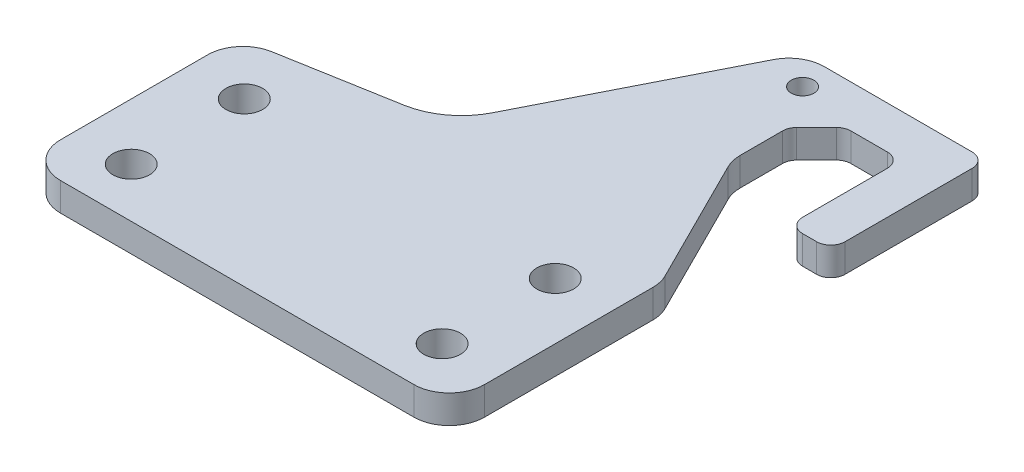
ISO-10303-21;
HEADER;
FILE_DESCRIPTION(('STEP AP214'),'2;1');
FILE_NAME('part.step','',(''),(''),'','','');
FILE_SCHEMA(('AUTOMOTIVE_DESIGN { 1 0 10303 214 1 1 1 1 }'));
ENDSEC;
DATA;
#1=APPLICATION_CONTEXT('core data for automotive mechanical design processes');
#2=APPLICATION_PROTOCOL_DEFINITION('international standard','automotive_design',2000,#1);
#3=PRODUCT_CONTEXT('',#1,'mechanical');
#4=PRODUCT('Part','Part','',(#3));
#5=PRODUCT_RELATED_PRODUCT_CATEGORY('part','',(#4));
#6=PRODUCT_DEFINITION_FORMATION('','',#4);
#7=PRODUCT_DEFINITION_CONTEXT('part definition',#1,'design');
#8=PRODUCT_DEFINITION('design','',#6,#7);
#9=PRODUCT_DEFINITION_SHAPE('','',#8);
#10=(LENGTH_UNIT() NAMED_UNIT(*) SI_UNIT(.MILLI.,.METRE.));
#11=(NAMED_UNIT(*) PLANE_ANGLE_UNIT() SI_UNIT($,.RADIAN.));
#12=(NAMED_UNIT(*) SI_UNIT($,.STERADIAN.) SOLID_ANGLE_UNIT());
#13=UNCERTAINTY_MEASURE_WITH_UNIT(LENGTH_MEASURE(1.E-05),#10,'distance_accuracy_value','');
#14=(GEOMETRIC_REPRESENTATION_CONTEXT(3) GLOBAL_UNCERTAINTY_ASSIGNED_CONTEXT((#13)) GLOBAL_UNIT_ASSIGNED_CONTEXT((#10,
#11,#12)) REPRESENTATION_CONTEXT('',''));
#15=CARTESIAN_POINT('',(0.,0.,0.));
#16=DIRECTION('',(0.,0.,1.));
#17=DIRECTION('',(1.,0.,0.));
#18=AXIS2_PLACEMENT_3D('',#15,#16,#17);
#19=CARTESIAN_POINT('',(30.,4.,-15.));
#20=DIRECTION('',(-0.894427190999916,0.,0.447213595499958));
#21=DIRECTION('',(0.447213595499958,0.,0.894427190999916));
#22=AXIS2_PLACEMENT_3D('',#19,#20,#21);
#23=PLANE('',#22);
#24=DIRECTION('',(-0.447213595499958,0.,-0.894427190999916));
#25=VECTOR('',#24,1.);
#26=CARTESIAN_POINT('',(30.,0.,-15.));
#27=LINE('',#26,#25);
#28=CARTESIAN_POINT('',(29.4721359549996,0.,-16.0557280900008));
#29=VERTEX_POINT('',#28);
#30=CARTESIAN_POINT('',(20.5278640450004,0.,-33.9442719099992));
#31=VERTEX_POINT('',#30);
#32=EDGE_CURVE('E432',#29,#31,#27,.T.);
#33=ORIENTED_EDGE('',*,*,#32,.T.);
#34=DIRECTION('',(0.,-1.,0.));
#35=VECTOR('',#34,1.);
#36=CARTESIAN_POINT('',(20.5278640450004,4.,-33.9442719099992));
#37=LINE('',#36,#35);
#38=CARTESIAN_POINT('',(20.5278640450004,4.,-33.9442719099992));
#39=VERTEX_POINT('',#38);
#40=EDGE_CURVE('E293',#31,#39,#37,.F.);
#41=ORIENTED_EDGE('',*,*,#40,.T.);
#42=DIRECTION('',(-0.447213595499958,0.,-0.894427190999916));
#43=VECTOR('',#42,1.);
#44=CARTESIAN_POINT('',(30.,4.,-15.));
#45=LINE('',#44,#43);
#46=CARTESIAN_POINT('',(29.4721359549996,4.,-16.0557280900008));
#47=VERTEX_POINT('',#46);
#48=EDGE_CURVE('E257',#47,#39,#45,.T.);
#49=ORIENTED_EDGE('',*,*,#48,.F.);
#50=DIRECTION('',(0.,-1.,0.));
#51=VECTOR('',#50,1.);
#52=CARTESIAN_POINT('',(29.4721359549996,4.,-16.0557280900008));
#53=LINE('',#52,#51);
#54=EDGE_CURVE('E290',#47,#29,#53,.T.);
#55=ORIENTED_EDGE('',*,*,#54,.T.);
#56=EDGE_LOOP('',(#33,#41,#49,#55));
#57=FACE_BOUND('',#56,.T.);
#58=ADVANCED_FACE('F43',(#57),#23,.F.);
#59=CARTESIAN_POINT('',(20.,4.,-35.));
#60=DIRECTION('',(-1.,0.,0.));
#61=DIRECTION('',(0.,0.,1.));
#62=AXIS2_PLACEMENT_3D('',#59,#60,#61);
#63=PLANE('',#62);
#64=DIRECTION('',(0.,0.,-1.));
#65=VECTOR('',#64,1.);
#66=CARTESIAN_POINT('',(20.,0.,-35.));
#67=LINE('',#66,#65);
#68=CARTESIAN_POINT('',(20.,0.,-36.180339887499));
#69=VERTEX_POINT('',#68);
#70=CARTESIAN_POINT('',(20.,0.,-42.1715728752538));
#71=VERTEX_POINT('',#70);
#72=EDGE_CURVE('E458',#69,#71,#67,.T.);
#73=ORIENTED_EDGE('',*,*,#72,.T.);
#74=DIRECTION('',(0.,-1.,0.));
#75=VECTOR('',#74,1.);
#76=CARTESIAN_POINT('',(20.,4.,-42.1715728752538));
#77=LINE('',#76,#75);
#78=CARTESIAN_POINT('',(20.,4.,-42.1715728752538));
#79=VERTEX_POINT('',#78);
#80=EDGE_CURVE('E321',#71,#79,#77,.F.);
#81=ORIENTED_EDGE('',*,*,#80,.T.);
#82=DIRECTION('',(0.,0.,-1.));
#83=VECTOR('',#82,1.);
#84=CARTESIAN_POINT('',(20.,4.,-35.));
#85=LINE('',#84,#83);
#86=CARTESIAN_POINT('',(20.,4.,-36.180339887499));
#87=VERTEX_POINT('',#86);
#88=EDGE_CURVE('E437',#87,#79,#85,.T.);
#89=ORIENTED_EDGE('',*,*,#88,.F.);
#90=DIRECTION('',(0.,-1.,0.));
#91=VECTOR('',#90,1.);
#92=CARTESIAN_POINT('',(20.,0.,-36.180339887499));
#93=LINE('',#92,#91);
#94=EDGE_CURVE('E287',#87,#69,#93,.T.);
#95=ORIENTED_EDGE('',*,*,#94,.T.);
#96=EDGE_LOOP('',(#73,#81,#89,#95));
#97=FACE_BOUND('',#96,.T.);
#98=ADVANCED_FACE('F516',(#97),#63,.F.);
#99=CARTESIAN_POINT('',(20.,4.,-43.));
#100=DIRECTION('',(-0.707106781186546,0.,-0.707106781186549));
#101=DIRECTION('',(-0.707106781186549,0.,0.707106781186546));
#102=AXIS2_PLACEMENT_3D('',#99,#100,#101);
#103=PLANE('',#102);
#104=DIRECTION('',(0.707106781186549,0.,-0.707106781186546));
#105=VECTOR('',#104,1.);
#106=CARTESIAN_POINT('',(20.,4.,-43.));
#107=LINE('',#106,#105);
#108=CARTESIAN_POINT('',(20.5857864376269,4.,-43.5857864376269));
#109=VERTEX_POINT('',#108);
#110=CARTESIAN_POINT('',(23.4142135623731,4.,-46.4142135623731));
#111=VERTEX_POINT('',#110);
#112=EDGE_CURVE('E440',#109,#111,#107,.T.);
#113=ORIENTED_EDGE('',*,*,#112,.F.);
#114=DIRECTION('',(0.,-1.,0.));
#115=VECTOR('',#114,1.);
#116=CARTESIAN_POINT('',(20.5857864376269,0.,-43.5857864376269));
#117=LINE('',#116,#115);
#118=CARTESIAN_POINT('',(20.5857864376269,0.,-43.5857864376269));
#119=VERTEX_POINT('',#118);
#120=EDGE_CURVE('E318',#109,#119,#117,.T.);
#121=ORIENTED_EDGE('',*,*,#120,.T.);
#122=DIRECTION('',(0.707106781186549,0.,-0.707106781186546));
#123=VECTOR('',#122,1.);
#124=CARTESIAN_POINT('',(20.,0.,-43.));
#125=LINE('',#124,#123);
#126=CARTESIAN_POINT('',(23.4142135623731,0.,-46.4142135623731));
#127=VERTEX_POINT('',#126);
#128=EDGE_CURVE('E461',#119,#127,#125,.T.);
#129=ORIENTED_EDGE('',*,*,#128,.T.);
#130=DIRECTION('',(0.,-1.,0.));
#131=VECTOR('',#130,1.);
#132=CARTESIAN_POINT('',(23.4142135623731,4.,-46.4142135623731));
#133=LINE('',#132,#131);
#134=EDGE_CURVE('E316',#127,#111,#133,.F.);
#135=ORIENTED_EDGE('',*,*,#134,.T.);
#136=EDGE_LOOP('',(#113,#121,#129,#135));
#137=FACE_BOUND('',#136,.T.);
#138=ADVANCED_FACE('F525',(#137),#103,.F.);
#139=CARTESIAN_POINT('',(24.,4.,-53.));
#140=DIRECTION('',(0.,0.,1.));
#141=DIRECTION('',(1.,0.,0.));
#142=AXIS2_PLACEMENT_3D('',#139,#140,#141);
#143=PLANE('',#142);
#144=DIRECTION('',(-1.,0.,0.));
#145=VECTOR('',#144,1.);
#146=CARTESIAN_POINT('',(24.,4.,-53.));
#147=LINE('',#146,#145);
#148=CARTESIAN_POINT('',(36.,4.,-53.));
#149=VERTEX_POINT('',#148);
#150=CARTESIAN_POINT('',(15.0734435338877,4.,-53.));
#151=VERTEX_POINT('',#150);
#152=EDGE_CURVE('E443',#149,#151,#147,.T.);
#153=ORIENTED_EDGE('',*,*,#152,.F.);
#154=DIRECTION('',(0.,1.,0.));
#155=VECTOR('',#154,1.);
#156=CARTESIAN_POINT('',(36.,0.,-53.));
#157=LINE('',#156,#155);
#158=CARTESIAN_POINT('',(36.,0.,-53.));
#159=VERTEX_POINT('',#158);
#160=EDGE_CURVE('E354',#149,#159,#157,.F.);
#161=ORIENTED_EDGE('',*,*,#160,.T.);
#162=DIRECTION('',(-1.,0.,0.));
#163=VECTOR('',#162,1.);
#164=CARTESIAN_POINT('',(24.,0.,-53.));
#165=LINE('',#164,#163);
#166=CARTESIAN_POINT('',(15.0734435338877,0.,-53.));
#167=VERTEX_POINT('',#166);
#168=EDGE_CURVE('E249',#159,#167,#165,.T.);
#169=ORIENTED_EDGE('',*,*,#168,.T.);
#170=DIRECTION('',(0.,-1.,0.));
#171=VECTOR('',#170,1.);
#172=CARTESIAN_POINT('',(15.0734435338877,4.,-53.));
#173=LINE('',#172,#171);
#174=EDGE_CURVE('E274',#167,#151,#173,.F.);
#175=ORIENTED_EDGE('',*,*,#174,.T.);
#176=EDGE_LOOP('',(#153,#161,#169,#175));
#177=FACE_BOUND('',#176,.T.);
#178=ADVANCED_FACE('F465',(#177),#143,.F.);
#179=CARTESIAN_POINT('',(12.,4.,-53.));
#180=DIRECTION('',(0.89224833437936,0.,0.451545025215934));
#181=DIRECTION('',(0.451545025215934,0.,-0.89224833437936));
#182=AXIS2_PLACEMENT_3D('',#179,#180,#181);
#183=PLANE('',#182);
#184=DIRECTION('',(-0.451545025215934,0.,0.89224833437936));
#185=VECTOR('',#184,1.);
#186=CARTESIAN_POINT('',(12.,4.,-53.));
#187=LINE('',#186,#185);
#188=CARTESIAN_POINT('',(10.6122018619909,4.,-50.2577251260797));
#189=VERTEX_POINT('',#188);
#190=CARTESIAN_POINT('',(-2.74094267925489,4.,-23.8720485925915));
#191=VERTEX_POINT('',#190);
#192=EDGE_CURVE('E445',#189,#191,#187,.T.);
#193=ORIENTED_EDGE('',*,*,#192,.F.);
#194=DIRECTION('',(0.,-1.,0.));
#195=VECTOR('',#194,1.);
#196=CARTESIAN_POINT('',(10.6122018619909,4.,-50.2577251260797));
#197=LINE('',#196,#195);
#198=CARTESIAN_POINT('',(10.6122018619909,0.,-50.2577251260797));
#199=VERTEX_POINT('',#198);
#200=EDGE_CURVE('E261',#189,#199,#197,.T.);
#201=ORIENTED_EDGE('',*,*,#200,.T.);
#202=DIRECTION('',(-0.451545025215934,0.,0.89224833437936));
#203=VECTOR('',#202,1.);
#204=CARTESIAN_POINT('',(12.,0.,-53.));
#205=LINE('',#204,#203);
#206=CARTESIAN_POINT('',(-2.74094267925489,0.,-23.8720485925915));
#207=VERTEX_POINT('',#206);
#208=EDGE_CURVE('E244',#199,#207,#205,.T.);
#209=ORIENTED_EDGE('',*,*,#208,.T.);
#210=DIRECTION('',(0.,-1.,0.));
#211=VECTOR('',#210,1.);
#212=CARTESIAN_POINT('',(-2.74094267925489,4.,-23.8720485925915));
#213=LINE('',#212,#211);
#214=EDGE_CURVE('E224',#207,#191,#213,.F.);
#215=ORIENTED_EDGE('',*,*,#214,.T.);
#216=EDGE_LOOP('',(#193,#201,#209,#215));
#217=FACE_BOUND('',#216,.T.);
#218=ADVANCED_FACE('F474',(#217),#183,.F.);
#219=CARTESIAN_POINT('',(-5.,4.,-19.4081745177117));
#220=DIRECTION('',(0.173648177666934,0.,0.984807753012207));
#221=DIRECTION('',(0.984807753012208,0.,-0.173648177666934));
#222=AXIS2_PLACEMENT_3D('',#219,#220,#221);
#223=PLANE('',#222);
#224=DIRECTION('',(-0.984807753012207,0.,0.173648177666934));
#225=VECTOR('',#224,1.);
#226=CARTESIAN_POINT('',(-5.,0.,-19.4081745177117));
#227=LINE('',#226,#225);
#228=CARTESIAN_POINT('',(-9.92694424637915,0.,-18.5394213146287));
#229=VERTEX_POINT('',#228);
#230=CARTESIAN_POINT('',(-25.8682408883347,0.,-15.7285406091747));
#231=VERTEX_POINT('',#230);
#232=EDGE_CURVE('E233',#229,#231,#227,.T.);
#233=ORIENTED_EDGE('',*,*,#232,.T.);
#234=DIRECTION('',(0.,-1.,0.));
#235=VECTOR('',#234,1.);
#236=CARTESIAN_POINT('',(-25.8682408883347,4.,-15.7285406091747));
#237=LINE('',#236,#235);
#238=CARTESIAN_POINT('',(-25.8682408883347,4.,-15.7285406091747));
#239=VERTEX_POINT('',#238);
#240=EDGE_CURVE('E310',#231,#239,#237,.F.);
#241=ORIENTED_EDGE('',*,*,#240,.T.);
#242=DIRECTION('',(-0.984807753012207,0.,0.173648177666934));
#243=VECTOR('',#242,1.);
#244=CARTESIAN_POINT('',(-5.,4.,-19.4081745177117));
#245=LINE('',#244,#243);
#246=CARTESIAN_POINT('',(-9.92694424637915,4.,-18.5394213146287));
#247=VERTEX_POINT('',#246);
#248=EDGE_CURVE('E236',#247,#239,#245,.T.);
#249=ORIENTED_EDGE('',*,*,#248,.F.);
#250=DIRECTION('',(0.,-1.,0.));
#251=VECTOR('',#250,1.);
#252=CARTESIAN_POINT('',(-9.92694424637915,0.,-18.5394213146287));
#253=LINE('',#252,#251);
#254=EDGE_CURVE('E222',#247,#229,#253,.T.);
#255=ORIENTED_EDGE('',*,*,#254,.T.);
#256=EDGE_LOOP('',(#233,#241,#249,#255));
#257=FACE_BOUND('',#256,.T.);
#258=ADVANCED_FACE('F232',(#257),#223,.F.);
#259=CARTESIAN_POINT('',(-30.,4.,15.));
#260=DIRECTION('',(1.,0.,0.));
#261=DIRECTION('',(0.,0.,-1.));
#262=AXIS2_PLACEMENT_3D('',#259,#260,#261);
#263=PLANE('',#262);
#264=DIRECTION('',(0.,0.,1.));
#265=VECTOR('',#264,1.);
#266=CARTESIAN_POINT('',(-30.,0.,15.));
#267=LINE('',#266,#265);
#268=CARTESIAN_POINT('',(-30.,0.,-10.8045018441136));
#269=VERTEX_POINT('',#268);
#270=CARTESIAN_POINT('',(-30.,0.,10.));
#271=VERTEX_POINT('',#270);
#272=EDGE_CURVE('E243',#269,#271,#267,.T.);
#273=ORIENTED_EDGE('',*,*,#272,.T.);
#274=DIRECTION('',(0.,-1.,0.));
#275=VECTOR('',#274,1.);
#276=CARTESIAN_POINT('',(-30.,4.,10.));
#277=LINE('',#276,#275);
#278=CARTESIAN_POINT('',(-30.,4.,10.));
#279=VERTEX_POINT('',#278);
#280=EDGE_CURVE('E308',#271,#279,#277,.F.);
#281=ORIENTED_EDGE('',*,*,#280,.T.);
#282=DIRECTION('',(0.,0.,1.));
#283=VECTOR('',#282,1.);
#284=CARTESIAN_POINT('',(-30.,4.,15.));
#285=LINE('',#284,#283);
#286=CARTESIAN_POINT('',(-30.,4.,-10.8045018441136));
#287=VERTEX_POINT('',#286);
#288=EDGE_CURVE('E448',#287,#279,#285,.T.);
#289=ORIENTED_EDGE('',*,*,#288,.F.);
#290=DIRECTION('',(0.,-1.,0.));
#291=VECTOR('',#290,1.);
#292=CARTESIAN_POINT('',(-30.,4.,-10.8045018441136));
#293=LINE('',#292,#291);
#294=EDGE_CURVE('E305',#287,#269,#293,.T.);
#295=ORIENTED_EDGE('',*,*,#294,.T.);
#296=EDGE_LOOP('',(#273,#281,#289,#295));
#297=FACE_BOUND('',#296,.T.);
#298=ADVANCED_FACE('F481',(#297),#263,.F.);
#299=CARTESIAN_POINT('',(-30.,4.,15.));
#300=DIRECTION('',(0.,0.,-1.));
#301=DIRECTION('',(-1.,0.,0.));
#302=AXIS2_PLACEMENT_3D('',#299,#300,#301);
#303=PLANE('',#302);
#304=DIRECTION('',(1.,0.,0.));
#305=VECTOR('',#304,1.);
#306=CARTESIAN_POINT('',(-30.,0.,15.));
#307=LINE('',#306,#305);
#308=CARTESIAN_POINT('',(-25.,0.,15.));
#309=VERTEX_POINT('',#308);
#310=CARTESIAN_POINT('',(25.,0.,15.));
#311=VERTEX_POINT('',#310);
#312=EDGE_CURVE('E247',#309,#311,#307,.T.);
#313=ORIENTED_EDGE('',*,*,#312,.T.);
#314=DIRECTION('',(0.,-1.,0.));
#315=VECTOR('',#314,1.);
#316=CARTESIAN_POINT('',(25.,4.,15.));
#317=LINE('',#316,#315);
#318=CARTESIAN_POINT('',(25.,4.,15.));
#319=VERTEX_POINT('',#318);
#320=EDGE_CURVE('E303',#311,#319,#317,.F.);
#321=ORIENTED_EDGE('',*,*,#320,.T.);
#322=DIRECTION('',(1.,0.,0.));
#323=VECTOR('',#322,1.);
#324=CARTESIAN_POINT('',(-30.,4.,15.));
#325=LINE('',#324,#323);
#326=CARTESIAN_POINT('',(-25.,4.,15.));
#327=VERTEX_POINT('',#326);
#328=EDGE_CURVE('E451',#327,#319,#325,.T.);
#329=ORIENTED_EDGE('',*,*,#328,.F.);
#330=DIRECTION('',(0.,-1.,0.));
#331=VECTOR('',#330,1.);
#332=CARTESIAN_POINT('',(-25.,4.,15.));
#333=LINE('',#332,#331);
#334=EDGE_CURVE('E300',#327,#309,#333,.T.);
#335=ORIENTED_EDGE('',*,*,#334,.T.);
#336=EDGE_LOOP('',(#313,#321,#329,#335));
#337=FACE_BOUND('',#336,.T.);
#338=ADVANCED_FACE('F490',(#337),#303,.F.);
#339=CARTESIAN_POINT('',(30.,4.,15.));
#340=DIRECTION('',(-1.,0.,0.));
#341=DIRECTION('',(0.,0.,1.));
#342=AXIS2_PLACEMENT_3D('',#339,#340,#341);
#343=PLANE('',#342);
#344=DIRECTION('',(0.,0.,-1.));
#345=VECTOR('',#344,1.);
#346=CARTESIAN_POINT('',(30.,0.,15.));
#347=LINE('',#346,#345);
#348=CARTESIAN_POINT('',(30.,0.,10.));
#349=VERTEX_POINT('',#348);
#350=CARTESIAN_POINT('',(30.,0.,-13.819660112501));
#351=VERTEX_POINT('',#350);
#352=EDGE_CURVE('E255',#349,#351,#347,.T.);
#353=ORIENTED_EDGE('',*,*,#352,.T.);
#354=DIRECTION('',(0.,-1.,0.));
#355=VECTOR('',#354,1.);
#356=CARTESIAN_POINT('',(30.,4.,-13.819660112501));
#357=LINE('',#356,#355);
#358=CARTESIAN_POINT('',(30.,4.,-13.819660112501));
#359=VERTEX_POINT('',#358);
#360=EDGE_CURVE('E298',#351,#359,#357,.F.);
#361=ORIENTED_EDGE('',*,*,#360,.T.);
#362=DIRECTION('',(0.,0.,-1.));
#363=VECTOR('',#362,1.);
#364=CARTESIAN_POINT('',(30.,4.,15.));
#365=LINE('',#364,#363);
#366=CARTESIAN_POINT('',(30.,4.,10.));
#367=VERTEX_POINT('',#366);
#368=EDGE_CURVE('E237',#367,#359,#365,.T.);
#369=ORIENTED_EDGE('',*,*,#368,.F.);
#370=DIRECTION('',(0.,-1.,0.));
#371=VECTOR('',#370,1.);
#372=CARTESIAN_POINT('',(30.,4.,10.));
#373=LINE('',#372,#371);
#374=EDGE_CURVE('E295',#367,#349,#373,.T.);
#375=ORIENTED_EDGE('',*,*,#374,.T.);
#376=EDGE_LOOP('',(#353,#361,#369,#375));
#377=FACE_BOUND('',#376,.T.);
#378=ADVANCED_FACE('F499',(#377),#343,.F.);
#379=CARTESIAN_POINT('',(0.,4.,0.));
#380=DIRECTION('',(0.,1.,0.));
#381=DIRECTION('',(0.,0.,1.));
#382=AXIS2_PLACEMENT_3D('',#379,#380,#381);
#383=PLANE('',#382);
#384=CARTESIAN_POINT('',(16.,4.,-49.));
#385=DIRECTION('',(0.,-1.,0.));
#386=DIRECTION('',(0.,0.,-1.));
#387=AXIS2_PLACEMENT_3D('',#384,#385,#386);
#388=CIRCLE('',#387,1.6);
#389=CARTESIAN_POINT('',(16.,4.,-50.6));
#390=VERTEX_POINT('',#389);
#391=EDGE_CURVE('E405',#390,#390,#388,.T.);
#392=ORIENTED_EDGE('',*,*,#391,.T.);
#393=EDGE_LOOP('',(#392));
#394=FACE_BOUND('',#393,.T.);
#395=CARTESIAN_POINT('',(-22.,4.,8.00000000000001));
#396=DIRECTION('',(0.,1.,0.));
#397=DIRECTION('',(0.,0.,-1.));
#398=AXIS2_PLACEMENT_3D('',#395,#396,#397);
#399=CIRCLE('',#398,2.6);
#400=CARTESIAN_POINT('',(-22.,4.,5.40000000000001));
#401=VERTEX_POINT('',#400);
#402=EDGE_CURVE('E408',#401,#401,#399,.T.);
#403=ORIENTED_EDGE('',*,*,#402,.F.);
#404=EDGE_LOOP('',(#403));
#405=FACE_BOUND('',#404,.T.);
#406=CARTESIAN_POINT('',(22.,4.,7.99999999999999));
#407=DIRECTION('',(0.,1.,0.));
#408=DIRECTION('',(0.,0.,1.));
#409=AXIS2_PLACEMENT_3D('',#406,#407,#408);
#410=CIRCLE('',#409,2.6);
#411=CARTESIAN_POINT('',(22.,4.,10.6));
#412=VERTEX_POINT('',#411);
#413=EDGE_CURVE('E421',#412,#412,#410,.T.);
#414=ORIENTED_EDGE('',*,*,#413,.F.);
#415=EDGE_LOOP('',(#414));
#416=FACE_BOUND('',#415,.T.);
#417=CARTESIAN_POINT('',(22.,4.,-8.));
#418=DIRECTION('',(0.,1.,0.));
#419=DIRECTION('',(0.,0.,-1.));
#420=AXIS2_PLACEMENT_3D('',#417,#418,#419);
#421=CIRCLE('',#420,2.6);
#422=CARTESIAN_POINT('',(22.,4.,-10.6));
#423=VERTEX_POINT('',#422);
#424=EDGE_CURVE('E415',#423,#423,#421,.T.);
#425=ORIENTED_EDGE('',*,*,#424,.F.);
#426=EDGE_LOOP('',(#425));
#427=FACE_BOUND('',#426,.T.);
#428=CARTESIAN_POINT('',(-22.,4.,-8.));
#429=DIRECTION('',(0.,1.,0.));
#430=DIRECTION('',(0.,0.,1.));
#431=AXIS2_PLACEMENT_3D('',#428,#429,#430);
#432=CIRCLE('',#431,2.6);
#433=CARTESIAN_POINT('',(-22.,4.,-5.4));
#434=VERTEX_POINT('',#433);
#435=EDGE_CURVE('E414',#434,#434,#432,.T.);
#436=ORIENTED_EDGE('',*,*,#435,.F.);
#437=EDGE_LOOP('',(#436));
#438=FACE_BOUND('',#437,.T.);
#439=DIRECTION('',(0.,0.,1.));
#440=VECTOR('',#439,1.);
#441=CARTESIAN_POINT('',(32.,4.,-47.));
#442=LINE('',#441,#440);
#443=CARTESIAN_POINT('',(32.,4.,-45.));
#444=VERTEX_POINT('',#443);
#445=CARTESIAN_POINT('',(32.,4.,-33.));
#446=VERTEX_POINT('',#445);
#447=EDGE_CURVE('E368',#444,#446,#442,.T.);
#448=ORIENTED_EDGE('',*,*,#447,.T.);
#449=CARTESIAN_POINT('',(34.,4.,-33.));
#450=DIRECTION('',(0.,1.,0.));
#451=DIRECTION('',(0.,0.,1.));
#452=AXIS2_PLACEMENT_3D('',#449,#450,#451);
#453=CIRCLE('',#452,2.);
#454=CARTESIAN_POINT('',(34.,4.,-31.));
#455=VERTEX_POINT('',#454);
#456=EDGE_CURVE('E338',#446,#455,#453,.T.);
#457=ORIENTED_EDGE('',*,*,#456,.T.);
#458=DIRECTION('',(1.,0.,0.));
#459=VECTOR('',#458,1.);
#460=CARTESIAN_POINT('',(32.,4.,-31.));
#461=LINE('',#460,#459);
#462=CARTESIAN_POINT('',(36.,4.,-31.));
#463=VERTEX_POINT('',#462);
#464=EDGE_CURVE('E379',#455,#463,#461,.T.);
#465=ORIENTED_EDGE('',*,*,#464,.T.);
#466=CARTESIAN_POINT('',(36.,4.,-33.));
#467=DIRECTION('',(0.,1.,0.));
#468=DIRECTION('',(0.,0.,1.));
#469=AXIS2_PLACEMENT_3D('',#466,#467,#468);
#470=CIRCLE('',#469,2.);
#471=CARTESIAN_POINT('',(38.,4.,-33.));
#472=VERTEX_POINT('',#471);
#473=EDGE_CURVE('E334',#463,#472,#470,.T.);
#474=ORIENTED_EDGE('',*,*,#473,.T.);
#475=DIRECTION('',(0.,0.,-1.));
#476=VECTOR('',#475,1.);
#477=CARTESIAN_POINT('',(38.,4.,-31.));
#478=LINE('',#477,#476);
#479=CARTESIAN_POINT('',(38.,4.,-51.));
#480=VERTEX_POINT('',#479);
#481=EDGE_CURVE('E390',#472,#480,#478,.T.);
#482=ORIENTED_EDGE('',*,*,#481,.T.);
#483=CARTESIAN_POINT('',(36.,4.,-51.));
#484=DIRECTION('',(0.,1.,0.));
#485=DIRECTION('',(0.,0.,1.));
#486=AXIS2_PLACEMENT_3D('',#483,#484,#485);
#487=CIRCLE('',#486,2.);
#488=EDGE_CURVE('E336',#480,#149,#487,.T.);
#489=ORIENTED_EDGE('',*,*,#488,.T.);
#490=ORIENTED_EDGE('',*,*,#152,.T.);
#491=CARTESIAN_POINT('',(15.0734435338877,4.,-48.));
#492=DIRECTION('',(0.,1.,0.));
#493=DIRECTION('',(0.,0.,1.));
#494=AXIS2_PLACEMENT_3D('',#491,#492,#493);
#495=CIRCLE('',#494,5.);
#496=EDGE_CURVE('E285',#151,#189,#495,.T.);
#497=ORIENTED_EDGE('',*,*,#496,.T.);
#498=ORIENTED_EDGE('',*,*,#192,.T.);
#499=CARTESIAN_POINT('',(-11.6634260230485,4.,-28.3874988447508));
#500=DIRECTION('',(0.,1.,0.));
#501=DIRECTION('',(0.,0.,1.));
#502=AXIS2_PLACEMENT_3D('',#499,#500,#501);
#503=CIRCLE('',#502,10.);
#504=EDGE_CURVE('E227',#191,#247,#503,.F.);
#505=ORIENTED_EDGE('',*,*,#504,.T.);
#506=ORIENTED_EDGE('',*,*,#248,.T.);
#507=CARTESIAN_POINT('',(-25.,4.,-10.8045018441136));
#508=DIRECTION('',(0.,1.,0.));
#509=DIRECTION('',(0.,0.,1.));
#510=AXIS2_PLACEMENT_3D('',#507,#508,#509);
#511=CIRCLE('',#510,5.);
#512=EDGE_CURVE('E277',#239,#287,#511,.T.);
#513=ORIENTED_EDGE('',*,*,#512,.T.);
#514=ORIENTED_EDGE('',*,*,#288,.T.);
#515=CARTESIAN_POINT('',(-25.,4.,10.));
#516=DIRECTION('',(0.,1.,0.));
#517=DIRECTION('',(0.,0.,1.));
#518=AXIS2_PLACEMENT_3D('',#515,#516,#517);
#519=CIRCLE('',#518,5.);
#520=EDGE_CURVE('E279',#279,#327,#519,.T.);
#521=ORIENTED_EDGE('',*,*,#520,.T.);
#522=ORIENTED_EDGE('',*,*,#328,.T.);
#523=CARTESIAN_POINT('',(25.,4.,10.));
#524=DIRECTION('',(0.,1.,0.));
#525=DIRECTION('',(0.,0.,1.));
#526=AXIS2_PLACEMENT_3D('',#523,#524,#525);
#527=CIRCLE('',#526,5.);
#528=EDGE_CURVE('E281',#319,#367,#527,.T.);
#529=ORIENTED_EDGE('',*,*,#528,.T.);
#530=ORIENTED_EDGE('',*,*,#368,.T.);
#531=CARTESIAN_POINT('',(25.,4.,-13.819660112501));
#532=DIRECTION('',(0.,1.,0.));
#533=DIRECTION('',(0.,0.,1.));
#534=AXIS2_PLACEMENT_3D('',#531,#532,#533);
#535=CIRCLE('',#534,5.);
#536=EDGE_CURVE('E283',#359,#47,#535,.T.);
#537=ORIENTED_EDGE('',*,*,#536,.T.);
#538=ORIENTED_EDGE('',*,*,#48,.T.);
#539=CARTESIAN_POINT('',(25.,4.,-36.180339887499));
#540=DIRECTION('',(0.,1.,0.));
#541=DIRECTION('',(0.,0.,1.));
#542=AXIS2_PLACEMENT_3D('',#539,#540,#541);
#543=CIRCLE('',#542,5.);
#544=EDGE_CURVE('E314',#39,#87,#543,.F.);
#545=ORIENTED_EDGE('',*,*,#544,.T.);
#546=ORIENTED_EDGE('',*,*,#88,.T.);
#547=CARTESIAN_POINT('',(22.,4.,-42.1715728752538));
#548=DIRECTION('',(0.,1.,0.));
#549=DIRECTION('',(0.,0.,1.));
#550=AXIS2_PLACEMENT_3D('',#547,#548,#549);
#551=CIRCLE('',#550,2.);
#552=EDGE_CURVE('E358',#79,#109,#551,.F.);
#553=ORIENTED_EDGE('',*,*,#552,.T.);
#554=ORIENTED_EDGE('',*,*,#112,.T.);
#555=CARTESIAN_POINT('',(24.8284271247462,4.,-45.));
#556=DIRECTION('',(0.,1.,0.));
#557=DIRECTION('',(0.,0.,1.));
#558=AXIS2_PLACEMENT_3D('',#555,#556,#557);
#559=CIRCLE('',#558,2.);
#560=CARTESIAN_POINT('',(24.8284271247462,4.,-47.));
#561=VERTEX_POINT('',#560);
#562=EDGE_CURVE('E362',#111,#561,#559,.F.);
#563=ORIENTED_EDGE('',*,*,#562,.T.);
#564=DIRECTION('',(1.,0.,0.));
#565=VECTOR('',#564,1.);
#566=CARTESIAN_POINT('',(24.,4.,-47.));
#567=LINE('',#566,#565);
#568=CARTESIAN_POINT('',(30.,4.,-47.));
#569=VERTEX_POINT('',#568);
#570=EDGE_CURVE('E370',#561,#569,#567,.T.);
#571=ORIENTED_EDGE('',*,*,#570,.T.);
#572=CARTESIAN_POINT('',(30.,4.,-45.));
#573=DIRECTION('',(0.,1.,0.));
#574=DIRECTION('',(0.,0.,1.));
#575=AXIS2_PLACEMENT_3D('',#572,#573,#574);
#576=CIRCLE('',#575,2.);
#577=EDGE_CURVE('E51',#569,#444,#576,.F.);
#578=ORIENTED_EDGE('',*,*,#577,.T.);
#579=EDGE_LOOP('',(#448,#457,#465,#474,#482,#489,#490,#497,#498,#505,#506,#513,#514,#521,#522,
#529,#530,#537,#538,#545,#546,#553,#554,#563,#571,#578));
#580=FACE_BOUND('',#579,.T.);
#581=ADVANCED_FACE('F367',(#394,#405,#416,#427,#438,#580),#383,.T.);
#582=CARTESIAN_POINT('',(0.,0.,0.));
#583=DIRECTION('',(0.,1.,0.));
#584=DIRECTION('',(0.,0.,1.));
#585=AXIS2_PLACEMENT_3D('',#582,#583,#584);
#586=PLANE('',#585);
#587=CARTESIAN_POINT('',(16.,0.,-49.));
#588=DIRECTION('',(0.,-1.,0.));
#589=DIRECTION('',(0.,0.,-1.));
#590=AXIS2_PLACEMENT_3D('',#587,#588,#589);
#591=CIRCLE('',#590,1.6);
#592=CARTESIAN_POINT('',(16.,0.,-50.6));
#593=VERTEX_POINT('',#592);
#594=EDGE_CURVE('E401',#593,#593,#591,.T.);
#595=ORIENTED_EDGE('',*,*,#594,.F.);
#596=EDGE_LOOP('',(#595));
#597=FACE_BOUND('',#596,.T.);
#598=CARTESIAN_POINT('',(-22.,0.,8.00000000000001));
#599=DIRECTION('',(0.,1.,0.));
#600=DIRECTION('',(0.,0.,-1.));
#601=AXIS2_PLACEMENT_3D('',#598,#599,#600);
#602=CIRCLE('',#601,2.6);
#603=CARTESIAN_POINT('',(-22.,0.,5.40000000000001));
#604=VERTEX_POINT('',#603);
#605=EDGE_CURVE('E424',#604,#604,#602,.T.);
#606=ORIENTED_EDGE('',*,*,#605,.T.);
#607=EDGE_LOOP('',(#606));
#608=FACE_BOUND('',#607,.T.);
#609=CARTESIAN_POINT('',(22.,0.,7.99999999999999));
#610=DIRECTION('',(0.,1.,0.));
#611=DIRECTION('',(0.,0.,1.));
#612=AXIS2_PLACEMENT_3D('',#609,#610,#611);
#613=CIRCLE('',#612,2.6);
#614=CARTESIAN_POINT('',(22.,0.,10.6));
#615=VERTEX_POINT('',#614);
#616=EDGE_CURVE('E418',#615,#615,#613,.T.);
#617=ORIENTED_EDGE('',*,*,#616,.T.);
#618=EDGE_LOOP('',(#617));
#619=FACE_BOUND('',#618,.T.);
#620=CARTESIAN_POINT('',(22.,0.,-8.));
#621=DIRECTION('',(0.,1.,0.));
#622=DIRECTION('',(0.,0.,-1.));
#623=AXIS2_PLACEMENT_3D('',#620,#621,#622);
#624=CIRCLE('',#623,2.6);
#625=CARTESIAN_POINT('',(22.,0.,-10.6));
#626=VERTEX_POINT('',#625);
#627=EDGE_CURVE('E411',#626,#626,#624,.T.);
#628=ORIENTED_EDGE('',*,*,#627,.T.);
#629=EDGE_LOOP('',(#628));
#630=FACE_BOUND('',#629,.T.);
#631=CARTESIAN_POINT('',(-22.,0.,-8.));
#632=DIRECTION('',(0.,1.,0.));
#633=DIRECTION('',(0.,0.,1.));
#634=AXIS2_PLACEMENT_3D('',#631,#632,#633);
#635=CIRCLE('',#634,2.6);
#636=CARTESIAN_POINT('',(-22.,0.,-5.4));
#637=VERTEX_POINT('',#636);
#638=EDGE_CURVE('E429',#637,#637,#635,.T.);
#639=ORIENTED_EDGE('',*,*,#638,.T.);
#640=EDGE_LOOP('',(#639));
#641=FACE_BOUND('',#640,.T.);
#642=DIRECTION('',(1.,0.,0.));
#643=VECTOR('',#642,1.);
#644=CARTESIAN_POINT('',(32.,0.,-31.));
#645=LINE('',#644,#643);
#646=CARTESIAN_POINT('',(34.,0.,-31.));
#647=VERTEX_POINT('',#646);
#648=CARTESIAN_POINT('',(36.,0.,-31.));
#649=VERTEX_POINT('',#648);
#650=EDGE_CURVE('E392',#647,#649,#645,.T.);
#651=ORIENTED_EDGE('',*,*,#650,.F.);
#652=CARTESIAN_POINT('',(34.,0.,-33.));
#653=DIRECTION('',(0.,1.,0.));
#654=DIRECTION('',(0.,0.,1.));
#655=AXIS2_PLACEMENT_3D('',#652,#653,#654);
#656=CIRCLE('',#655,2.);
#657=CARTESIAN_POINT('',(32.,0.,-33.));
#658=VERTEX_POINT('',#657);
#659=EDGE_CURVE('E348',#647,#658,#656,.F.);
#660=ORIENTED_EDGE('',*,*,#659,.T.);
#661=DIRECTION('',(0.,0.,1.));
#662=VECTOR('',#661,1.);
#663=CARTESIAN_POINT('',(32.,0.,-47.));
#664=LINE('',#663,#662);
#665=CARTESIAN_POINT('',(32.,0.,-45.));
#666=VERTEX_POINT('',#665);
#667=EDGE_CURVE('E386',#666,#658,#664,.T.);
#668=ORIENTED_EDGE('',*,*,#667,.F.);
#669=CARTESIAN_POINT('',(30.,0.,-45.));
#670=DIRECTION('',(0.,1.,0.));
#671=DIRECTION('',(0.,0.,1.));
#672=AXIS2_PLACEMENT_3D('',#669,#670,#671);
#673=CIRCLE('',#672,2.);
#674=CARTESIAN_POINT('',(30.,0.,-47.));
#675=VERTEX_POINT('',#674);
#676=EDGE_CURVE('E11',#666,#675,#673,.T.);
#677=ORIENTED_EDGE('',*,*,#676,.T.);
#678=DIRECTION('',(1.,0.,0.));
#679=VECTOR('',#678,1.);
#680=CARTESIAN_POINT('',(24.,0.,-47.));
#681=LINE('',#680,#679);
#682=CARTESIAN_POINT('',(24.8284271247462,0.,-47.));
#683=VERTEX_POINT('',#682);
#684=EDGE_CURVE('E385',#683,#675,#681,.T.);
#685=ORIENTED_EDGE('',*,*,#684,.F.);
#686=CARTESIAN_POINT('',(24.8284271247462,0.,-45.));
#687=DIRECTION('',(0.,1.,0.));
#688=DIRECTION('',(0.,0.,1.));
#689=AXIS2_PLACEMENT_3D('',#686,#687,#688);
#690=CIRCLE('',#689,2.);
#691=EDGE_CURVE('E360',#683,#127,#690,.T.);
#692=ORIENTED_EDGE('',*,*,#691,.T.);
#693=ORIENTED_EDGE('',*,*,#128,.F.);
#694=CARTESIAN_POINT('',(22.,0.,-42.1715728752538));
#695=DIRECTION('',(0.,1.,0.));
#696=DIRECTION('',(0.,0.,1.));
#697=AXIS2_PLACEMENT_3D('',#694,#695,#696);
#698=CIRCLE('',#697,2.);
#699=EDGE_CURVE('E356',#119,#71,#698,.T.);
#700=ORIENTED_EDGE('',*,*,#699,.T.);
#701=ORIENTED_EDGE('',*,*,#72,.F.);
#702=CARTESIAN_POINT('',(25.,0.,-36.180339887499));
#703=DIRECTION('',(0.,1.,0.));
#704=DIRECTION('',(0.,0.,1.));
#705=AXIS2_PLACEMENT_3D('',#702,#703,#704);
#706=CIRCLE('',#705,5.);
#707=EDGE_CURVE('E312',#69,#31,#706,.T.);
#708=ORIENTED_EDGE('',*,*,#707,.T.);
#709=ORIENTED_EDGE('',*,*,#32,.F.);
#710=CARTESIAN_POINT('',(25.,0.,-13.819660112501));
#711=DIRECTION('',(0.,1.,0.));
#712=DIRECTION('',(0.,0.,1.));
#713=AXIS2_PLACEMENT_3D('',#710,#711,#712);
#714=CIRCLE('',#713,5.);
#715=EDGE_CURVE('E269',#29,#351,#714,.F.);
#716=ORIENTED_EDGE('',*,*,#715,.T.);
#717=ORIENTED_EDGE('',*,*,#352,.F.);
#718=CARTESIAN_POINT('',(25.,0.,10.));
#719=DIRECTION('',(0.,1.,0.));
#720=DIRECTION('',(0.,0.,1.));
#721=AXIS2_PLACEMENT_3D('',#718,#719,#720);
#722=CIRCLE('',#721,5.);
#723=EDGE_CURVE('E267',#349,#311,#722,.F.);
#724=ORIENTED_EDGE('',*,*,#723,.T.);
#725=ORIENTED_EDGE('',*,*,#312,.F.);
#726=CARTESIAN_POINT('',(-25.,0.,10.));
#727=DIRECTION('',(0.,1.,0.));
#728=DIRECTION('',(0.,0.,1.));
#729=AXIS2_PLACEMENT_3D('',#726,#727,#728);
#730=CIRCLE('',#729,5.);
#731=EDGE_CURVE('E265',#309,#271,#730,.F.);
#732=ORIENTED_EDGE('',*,*,#731,.T.);
#733=ORIENTED_EDGE('',*,*,#272,.F.);
#734=CARTESIAN_POINT('',(-25.,0.,-10.8045018441136));
#735=DIRECTION('',(0.,1.,0.));
#736=DIRECTION('',(0.,0.,1.));
#737=AXIS2_PLACEMENT_3D('',#734,#735,#736);
#738=CIRCLE('',#737,5.);
#739=EDGE_CURVE('E242',#269,#231,#738,.F.);
#740=ORIENTED_EDGE('',*,*,#739,.T.);
#741=ORIENTED_EDGE('',*,*,#232,.F.);
#742=CARTESIAN_POINT('',(-11.6634260230485,0.,-28.3874988447508));
#743=DIRECTION('',(0.,1.,0.));
#744=DIRECTION('',(0.,0.,1.));
#745=AXIS2_PLACEMENT_3D('',#742,#743,#744);
#746=CIRCLE('',#745,10.);
#747=EDGE_CURVE('E218',#229,#207,#746,.T.);
#748=ORIENTED_EDGE('',*,*,#747,.T.);
#749=ORIENTED_EDGE('',*,*,#208,.F.);
#750=CARTESIAN_POINT('',(15.0734435338877,0.,-48.));
#751=DIRECTION('',(0.,1.,0.));
#752=DIRECTION('',(0.,0.,1.));
#753=AXIS2_PLACEMENT_3D('',#750,#751,#752);
#754=CIRCLE('',#753,5.);
#755=EDGE_CURVE('E271',#199,#167,#754,.F.);
#756=ORIENTED_EDGE('',*,*,#755,.T.);
#757=ORIENTED_EDGE('',*,*,#168,.F.);
#758=CARTESIAN_POINT('',(36.,0.,-51.));
#759=DIRECTION('',(0.,1.,0.));
#760=DIRECTION('',(0.,0.,1.));
#761=AXIS2_PLACEMENT_3D('',#758,#759,#760);
#762=CIRCLE('',#761,2.);
#763=CARTESIAN_POINT('',(38.,0.,-51.));
#764=VERTEX_POINT('',#763);
#765=EDGE_CURVE('E58',#159,#764,#762,.F.);
#766=ORIENTED_EDGE('',*,*,#765,.T.);
#767=DIRECTION('',(0.,0.,-1.));
#768=VECTOR('',#767,1.);
#769=CARTESIAN_POINT('',(38.,0.,-31.));
#770=LINE('',#769,#768);
#771=CARTESIAN_POINT('',(38.,0.,-33.));
#772=VERTEX_POINT('',#771);
#773=EDGE_CURVE('E399',#772,#764,#770,.T.);
#774=ORIENTED_EDGE('',*,*,#773,.F.);
#775=CARTESIAN_POINT('',(36.,0.,-33.));
#776=DIRECTION('',(0.,1.,0.));
#777=DIRECTION('',(0.,0.,1.));
#778=AXIS2_PLACEMENT_3D('',#775,#776,#777);
#779=CIRCLE('',#778,2.);
#780=EDGE_CURVE('E345',#772,#649,#779,.F.);
#781=ORIENTED_EDGE('',*,*,#780,.T.);
#782=EDGE_LOOP('',(#651,#660,#668,#677,#685,#692,#693,#700,#701,#708,#709,#716,#717,#724,#725,
#732,#733,#740,#741,#748,#749,#756,#757,#766,#774,#781));
#783=FACE_BOUND('',#782,.T.);
#784=ADVANCED_FACE('F240',(#597,#608,#619,#630,#641,#783),#586,.F.);
#785=CARTESIAN_POINT('',(-11.6634260230485,4.,-28.3874988447508));
#786=DIRECTION('',(0.,1.,0.));
#787=DIRECTION('',(0.,0.,1.));
#788=AXIS2_PLACEMENT_3D('',#785,#786,#787);
#789=CYLINDRICAL_SURFACE('',#788,10.);
#790=ORIENTED_EDGE('',*,*,#504,.F.);
#791=ORIENTED_EDGE('',*,*,#214,.F.);
#792=ORIENTED_EDGE('',*,*,#747,.F.);
#793=ORIENTED_EDGE('',*,*,#254,.F.);
#794=EDGE_LOOP('',(#790,#791,#792,#793));
#795=FACE_BOUND('',#794,.T.);
#796=ADVANCED_FACE('F221',(#795),#789,.F.);
#797=CARTESIAN_POINT('',(15.0734435338877,4.,-48.));
#798=DIRECTION('',(0.,-1.,0.));
#799=DIRECTION('',(0.,0.,-1.));
#800=AXIS2_PLACEMENT_3D('',#797,#798,#799);
#801=CYLINDRICAL_SURFACE('',#800,5.);
#802=ORIENTED_EDGE('',*,*,#496,.F.);
#803=ORIENTED_EDGE('',*,*,#174,.F.);
#804=ORIENTED_EDGE('',*,*,#755,.F.);
#805=ORIENTED_EDGE('',*,*,#200,.F.);
#806=EDGE_LOOP('',(#802,#803,#804,#805));
#807=FACE_BOUND('',#806,.T.);
#808=ADVANCED_FACE('F471',(#807),#801,.T.);
#809=CARTESIAN_POINT('',(25.,4.,-36.180339887499));
#810=DIRECTION('',(0.,1.,0.));
#811=DIRECTION('',(0.,0.,1.));
#812=AXIS2_PLACEMENT_3D('',#809,#810,#811);
#813=CYLINDRICAL_SURFACE('',#812,5.);
#814=ORIENTED_EDGE('',*,*,#544,.F.);
#815=ORIENTED_EDGE('',*,*,#40,.F.);
#816=ORIENTED_EDGE('',*,*,#707,.F.);
#817=ORIENTED_EDGE('',*,*,#94,.F.);
#818=EDGE_LOOP('',(#814,#815,#816,#817));
#819=FACE_BOUND('',#818,.T.);
#820=ADVANCED_FACE('F513',(#819),#813,.F.);
#821=CARTESIAN_POINT('',(25.,4.,-13.819660112501));
#822=DIRECTION('',(0.,-1.,0.));
#823=DIRECTION('',(0.,0.,-1.));
#824=AXIS2_PLACEMENT_3D('',#821,#822,#823);
#825=CYLINDRICAL_SURFACE('',#824,5.);
#826=ORIENTED_EDGE('',*,*,#536,.F.);
#827=ORIENTED_EDGE('',*,*,#360,.F.);
#828=ORIENTED_EDGE('',*,*,#715,.F.);
#829=ORIENTED_EDGE('',*,*,#54,.F.);
#830=EDGE_LOOP('',(#826,#827,#828,#829));
#831=FACE_BOUND('',#830,.T.);
#832=ADVANCED_FACE('F505',(#831),#825,.T.);
#833=CARTESIAN_POINT('',(25.,4.,10.));
#834=DIRECTION('',(0.,-1.,0.));
#835=DIRECTION('',(0.,0.,-1.));
#836=AXIS2_PLACEMENT_3D('',#833,#834,#835);
#837=CYLINDRICAL_SURFACE('',#836,5.);
#838=ORIENTED_EDGE('',*,*,#528,.F.);
#839=ORIENTED_EDGE('',*,*,#320,.F.);
#840=ORIENTED_EDGE('',*,*,#723,.F.);
#841=ORIENTED_EDGE('',*,*,#374,.F.);
#842=EDGE_LOOP('',(#838,#839,#840,#841));
#843=FACE_BOUND('',#842,.T.);
#844=ADVANCED_FACE('F496',(#843),#837,.T.);
#845=CARTESIAN_POINT('',(-25.,4.,10.));
#846=DIRECTION('',(0.,-1.,0.));
#847=DIRECTION('',(0.,0.,-1.));
#848=AXIS2_PLACEMENT_3D('',#845,#846,#847);
#849=CYLINDRICAL_SURFACE('',#848,5.);
#850=ORIENTED_EDGE('',*,*,#520,.F.);
#851=ORIENTED_EDGE('',*,*,#280,.F.);
#852=ORIENTED_EDGE('',*,*,#731,.F.);
#853=ORIENTED_EDGE('',*,*,#334,.F.);
#854=EDGE_LOOP('',(#850,#851,#852,#853));
#855=FACE_BOUND('',#854,.T.);
#856=ADVANCED_FACE('F487',(#855),#849,.T.);
#857=CARTESIAN_POINT('',(-25.,4.,-10.8045018441136));
#858=DIRECTION('',(0.,-1.,0.));
#859=DIRECTION('',(0.,0.,-1.));
#860=AXIS2_PLACEMENT_3D('',#857,#858,#859);
#861=CYLINDRICAL_SURFACE('',#860,5.);
#862=ORIENTED_EDGE('',*,*,#512,.F.);
#863=ORIENTED_EDGE('',*,*,#240,.F.);
#864=ORIENTED_EDGE('',*,*,#739,.F.);
#865=ORIENTED_EDGE('',*,*,#294,.F.);
#866=EDGE_LOOP('',(#862,#863,#864,#865));
#867=FACE_BOUND('',#866,.T.);
#868=ADVANCED_FACE('F479',(#867),#861,.T.);
#869=CARTESIAN_POINT('',(-22.,0.,-8.));
#870=DIRECTION('',(0.,1.,0.));
#871=DIRECTION('',(0.,0.,1.));
#872=AXIS2_PLACEMENT_3D('',#869,#870,#871);
#873=CYLINDRICAL_SURFACE('',#872,2.6);
#874=ORIENTED_EDGE('',*,*,#638,.F.);
#875=EDGE_LOOP('',(#874));
#876=FACE_BOUND('',#875,.T.);
#877=ORIENTED_EDGE('',*,*,#435,.T.);
#878=EDGE_LOOP('',(#877));
#879=FACE_BOUND('',#878,.T.);
#880=ADVANCED_FACE('F561',(#876,#879),#873,.F.);
#881=CARTESIAN_POINT('',(22.,0.,-8.));
#882=DIRECTION('',(0.,1.,0.));
#883=DIRECTION('',(0.,0.,1.));
#884=AXIS2_PLACEMENT_3D('',#881,#882,#883);
#885=CYLINDRICAL_SURFACE('',#884,2.6);
#886=ORIENTED_EDGE('',*,*,#627,.F.);
#887=EDGE_LOOP('',(#886));
#888=FACE_BOUND('',#887,.T.);
#889=ORIENTED_EDGE('',*,*,#424,.T.);
#890=EDGE_LOOP('',(#889));
#891=FACE_BOUND('',#890,.T.);
#892=ADVANCED_FACE('F565',(#888,#891),#885,.F.);
#893=CARTESIAN_POINT('',(22.,0.,7.99999999999999));
#894=DIRECTION('',(0.,1.,0.));
#895=DIRECTION('',(0.,0.,1.));
#896=AXIS2_PLACEMENT_3D('',#893,#894,#895);
#897=CYLINDRICAL_SURFACE('',#896,2.6);
#898=ORIENTED_EDGE('',*,*,#616,.F.);
#899=EDGE_LOOP('',(#898));
#900=FACE_BOUND('',#899,.T.);
#901=ORIENTED_EDGE('',*,*,#413,.T.);
#902=EDGE_LOOP('',(#901));
#903=FACE_BOUND('',#902,.T.);
#904=ADVANCED_FACE('F571',(#900,#903),#897,.F.);
#905=CARTESIAN_POINT('',(-22.,0.,8.00000000000001));
#906=DIRECTION('',(0.,1.,0.));
#907=DIRECTION('',(0.,0.,1.));
#908=AXIS2_PLACEMENT_3D('',#905,#906,#907);
#909=CYLINDRICAL_SURFACE('',#908,2.6);
#910=ORIENTED_EDGE('',*,*,#605,.F.);
#911=EDGE_LOOP('',(#910));
#912=FACE_BOUND('',#911,.T.);
#913=ORIENTED_EDGE('',*,*,#402,.T.);
#914=EDGE_LOOP('',(#913));
#915=FACE_BOUND('',#914,.T.);
#916=ADVANCED_FACE('F578',(#912,#915),#909,.F.);
#917=CARTESIAN_POINT('',(16.,4.,-49.));
#918=DIRECTION('',(0.,-1.,0.));
#919=DIRECTION('',(0.,0.,-1.));
#920=AXIS2_PLACEMENT_3D('',#917,#918,#919);
#921=CYLINDRICAL_SURFACE('',#920,1.6);
#922=ORIENTED_EDGE('',*,*,#391,.F.);
#923=EDGE_LOOP('',(#922));
#924=FACE_BOUND('',#923,.T.);
#925=ORIENTED_EDGE('',*,*,#594,.T.);
#926=EDGE_LOOP('',(#925));
#927=FACE_BOUND('',#926,.T.);
#928=ADVANCED_FACE('F627',(#924,#927),#921,.F.);
#929=CARTESIAN_POINT('',(38.,0.,-31.));
#930=DIRECTION('',(1.,0.,0.));
#931=DIRECTION('',(0.,0.,-1.));
#932=AXIS2_PLACEMENT_3D('',#929,#930,#931);
#933=PLANE('',#932);
#934=ORIENTED_EDGE('',*,*,#773,.T.);
#935=DIRECTION('',(0.,1.,0.));
#936=VECTOR('',#935,1.);
#937=CARTESIAN_POINT('',(38.,4.,-51.));
#938=LINE('',#937,#936);
#939=EDGE_CURVE('E351',#764,#480,#938,.T.);
#940=ORIENTED_EDGE('',*,*,#939,.T.);
#941=ORIENTED_EDGE('',*,*,#481,.F.);
#942=DIRECTION('',(0.,1.,0.));
#943=VECTOR('',#942,1.);
#944=CARTESIAN_POINT('',(38.,0.,-33.));
#945=LINE('',#944,#943);
#946=EDGE_CURVE('E65',#472,#772,#945,.F.);
#947=ORIENTED_EDGE('',*,*,#946,.T.);
#948=EDGE_LOOP('',(#934,#940,#941,#947));
#949=FACE_BOUND('',#948,.T.);
#950=ADVANCED_FACE('F623',(#949),#933,.T.);
#951=CARTESIAN_POINT('',(32.,0.,-31.));
#952=DIRECTION('',(0.,0.,1.));
#953=DIRECTION('',(1.,0.,0.));
#954=AXIS2_PLACEMENT_3D('',#951,#952,#953);
#955=PLANE('',#954);
#956=ORIENTED_EDGE('',*,*,#464,.F.);
#957=DIRECTION('',(0.,1.,0.));
#958=VECTOR('',#957,1.);
#959=CARTESIAN_POINT('',(34.,0.,-31.));
#960=LINE('',#959,#958);
#961=EDGE_CURVE('E343',#455,#647,#960,.F.);
#962=ORIENTED_EDGE('',*,*,#961,.T.);
#963=ORIENTED_EDGE('',*,*,#650,.T.);
#964=DIRECTION('',(0.,1.,0.));
#965=VECTOR('',#964,1.);
#966=CARTESIAN_POINT('',(36.,0.,-31.));
#967=LINE('',#966,#965);
#968=EDGE_CURVE('E340',#649,#463,#967,.T.);
#969=ORIENTED_EDGE('',*,*,#968,.T.);
#970=EDGE_LOOP('',(#956,#962,#963,#969));
#971=FACE_BOUND('',#970,.T.);
#972=ADVANCED_FACE('F626',(#971),#955,.T.);
#973=CARTESIAN_POINT('',(32.,0.,-47.));
#974=DIRECTION('',(-1.,0.,0.));
#975=DIRECTION('',(0.,0.,1.));
#976=AXIS2_PLACEMENT_3D('',#973,#974,#975);
#977=PLANE('',#976);
#978=ORIENTED_EDGE('',*,*,#447,.F.);
#979=DIRECTION('',(0.,1.,0.));
#980=VECTOR('',#979,1.);
#981=CARTESIAN_POINT('',(32.,0.,-45.));
#982=LINE('',#981,#980);
#983=EDGE_CURVE('E332',#444,#666,#982,.F.);
#984=ORIENTED_EDGE('',*,*,#983,.T.);
#985=ORIENTED_EDGE('',*,*,#667,.T.);
#986=DIRECTION('',(0.,1.,0.));
#987=VECTOR('',#986,1.);
#988=CARTESIAN_POINT('',(32.,0.,-33.));
#989=LINE('',#988,#987);
#990=EDGE_CURVE('E329',#658,#446,#989,.T.);
#991=ORIENTED_EDGE('',*,*,#990,.T.);
#992=EDGE_LOOP('',(#978,#984,#985,#991));
#993=FACE_BOUND('',#992,.T.);
#994=ADVANCED_FACE('F375',(#993),#977,.T.);
#995=CARTESIAN_POINT('',(24.,0.,-47.));
#996=DIRECTION('',(0.,0.,1.));
#997=DIRECTION('',(1.,0.,0.));
#998=AXIS2_PLACEMENT_3D('',#995,#996,#997);
#999=PLANE('',#998);
#1000=ORIENTED_EDGE('',*,*,#570,.F.);
#1001=DIRECTION('',(0.,-1.,0.));
#1002=VECTOR('',#1001,1.);
#1003=CARTESIAN_POINT('',(24.8284271247462,0.,-47.));
#1004=LINE('',#1003,#1002);
#1005=EDGE_CURVE('E326',#561,#683,#1004,.T.);
#1006=ORIENTED_EDGE('',*,*,#1005,.T.);
#1007=ORIENTED_EDGE('',*,*,#684,.T.);
#1008=DIRECTION('',(0.,1.,0.));
#1009=VECTOR('',#1008,1.);
#1010=CARTESIAN_POINT('',(30.,4.,-47.));
#1011=LINE('',#1010,#1009);
#1012=EDGE_CURVE('E323',#675,#569,#1011,.T.);
#1013=ORIENTED_EDGE('',*,*,#1012,.T.);
#1014=EDGE_LOOP('',(#1000,#1006,#1007,#1013));
#1015=FACE_BOUND('',#1014,.T.);
#1016=ADVANCED_FACE('F388',(#1015),#999,.T.);
#1017=CARTESIAN_POINT('',(22.,4.,-42.1715728752538));
#1018=DIRECTION('',(0.,1.,0.));
#1019=DIRECTION('',(0.,0.,1.));
#1020=AXIS2_PLACEMENT_3D('',#1017,#1018,#1019);
#1021=CYLINDRICAL_SURFACE('',#1020,2.);
#1022=ORIENTED_EDGE('',*,*,#552,.F.);
#1023=ORIENTED_EDGE('',*,*,#80,.F.);
#1024=ORIENTED_EDGE('',*,*,#699,.F.);
#1025=ORIENTED_EDGE('',*,*,#120,.F.);
#1026=EDGE_LOOP('',(#1022,#1023,#1024,#1025));
#1027=FACE_BOUND('',#1026,.T.);
#1028=ADVANCED_FACE('F522',(#1027),#1021,.F.);
#1029=CARTESIAN_POINT('',(24.8284271247462,0.,-45.));
#1030=DIRECTION('',(0.,-1.,0.));
#1031=DIRECTION('',(0.,0.,-1.));
#1032=AXIS2_PLACEMENT_3D('',#1029,#1030,#1031);
#1033=CYLINDRICAL_SURFACE('',#1032,2.);
#1034=ORIENTED_EDGE('',*,*,#562,.F.);
#1035=ORIENTED_EDGE('',*,*,#134,.F.);
#1036=ORIENTED_EDGE('',*,*,#691,.F.);
#1037=ORIENTED_EDGE('',*,*,#1005,.F.);
#1038=EDGE_LOOP('',(#1034,#1035,#1036,#1037));
#1039=FACE_BOUND('',#1038,.T.);
#1040=ADVANCED_FACE('F529',(#1039),#1033,.F.);
#1041=CARTESIAN_POINT('',(30.,0.,-45.));
#1042=DIRECTION('',(0.,-1.,0.));
#1043=DIRECTION('',(0.,0.,-1.));
#1044=AXIS2_PLACEMENT_3D('',#1041,#1042,#1043);
#1045=CYLINDRICAL_SURFACE('',#1044,2.);
#1046=ORIENTED_EDGE('',*,*,#676,.F.);
#1047=ORIENTED_EDGE('',*,*,#983,.F.);
#1048=ORIENTED_EDGE('',*,*,#577,.F.);
#1049=ORIENTED_EDGE('',*,*,#1012,.F.);
#1050=EDGE_LOOP('',(#1046,#1047,#1048,#1049));
#1051=FACE_BOUND('',#1050,.T.);
#1052=ADVANCED_FACE('F382',(#1051),#1045,.F.);
#1053=CARTESIAN_POINT('',(34.,0.,-33.));
#1054=DIRECTION('',(0.,1.,0.));
#1055=DIRECTION('',(0.,0.,1.));
#1056=AXIS2_PLACEMENT_3D('',#1053,#1054,#1055);
#1057=CYLINDRICAL_SURFACE('',#1056,2.);
#1058=ORIENTED_EDGE('',*,*,#659,.F.);
#1059=ORIENTED_EDGE('',*,*,#961,.F.);
#1060=ORIENTED_EDGE('',*,*,#456,.F.);
#1061=ORIENTED_EDGE('',*,*,#990,.F.);
#1062=EDGE_LOOP('',(#1058,#1059,#1060,#1061));
#1063=FACE_BOUND('',#1062,.T.);
#1064=ADVANCED_FACE('F536',(#1063),#1057,.T.);
#1065=CARTESIAN_POINT('',(36.,0.,-51.));
#1066=DIRECTION('',(0.,-1.,0.));
#1067=DIRECTION('',(0.,0.,-1.));
#1068=AXIS2_PLACEMENT_3D('',#1065,#1066,#1067);
#1069=CYLINDRICAL_SURFACE('',#1068,2.);
#1070=ORIENTED_EDGE('',*,*,#765,.F.);
#1071=ORIENTED_EDGE('',*,*,#160,.F.);
#1072=ORIENTED_EDGE('',*,*,#488,.F.);
#1073=ORIENTED_EDGE('',*,*,#939,.F.);
#1074=EDGE_LOOP('',(#1070,#1071,#1072,#1073));
#1075=FACE_BOUND('',#1074,.T.);
#1076=ADVANCED_FACE('F675',(#1075),#1069,.T.);
#1077=CARTESIAN_POINT('',(36.,0.,-33.));
#1078=DIRECTION('',(0.,1.,0.));
#1079=DIRECTION('',(0.,0.,1.));
#1080=AXIS2_PLACEMENT_3D('',#1077,#1078,#1079);
#1081=CYLINDRICAL_SURFACE('',#1080,2.);
#1082=ORIENTED_EDGE('',*,*,#780,.F.);
#1083=ORIENTED_EDGE('',*,*,#946,.F.);
#1084=ORIENTED_EDGE('',*,*,#473,.F.);
#1085=ORIENTED_EDGE('',*,*,#968,.F.);
#1086=EDGE_LOOP('',(#1082,#1083,#1084,#1085));
#1087=FACE_BOUND('',#1086,.T.);
#1088=ADVANCED_FACE('F45',(#1087),#1081,.T.);
#1089=CLOSED_SHELL('',(#58,#98,#138,#178,#218,#258,#298,#338,#378,#581,#784,#796,#808,#820,#832,
#844,#856,#868,#880,#892,#904,#916,#928,#950,#972,#994,#1016,#1028,#1040,#1052,#1064,#1076,#1088));
#1090=MANIFOLD_SOLID_BREP('B2',#1089);
#1091=ADVANCED_BREP_SHAPE_REPRESENTATION('',(#18,#1090),#14);
#1092=SHAPE_DEFINITION_REPRESENTATION(#9,#1091);
ENDSEC;
END-ISO-10303-21;
